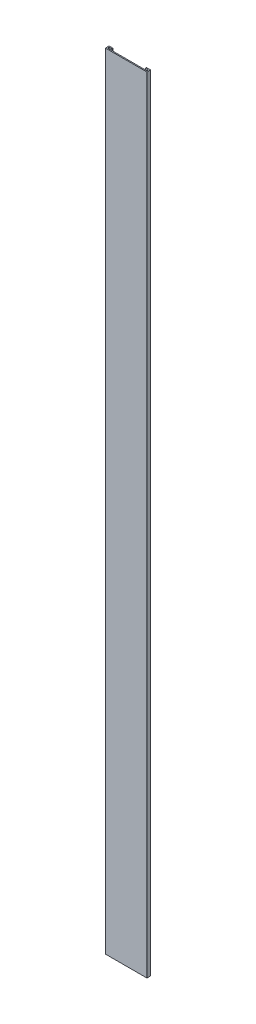
ISO-10303-21;
HEADER;
FILE_DESCRIPTION(('STEP AP214'),'2;1');
FILE_NAME('part.step','',(''),(''),'','','');
FILE_SCHEMA(('AUTOMOTIVE_DESIGN { 1 0 10303 214 1 1 1 1 }'));
ENDSEC;
DATA;
#1=APPLICATION_CONTEXT('core data for automotive mechanical design processes');
#2=APPLICATION_PROTOCOL_DEFINITION('international standard','automotive_design',2000,#1);
#3=PRODUCT_CONTEXT('',#1,'mechanical');
#4=PRODUCT('Part','Part','',(#3));
#5=PRODUCT_RELATED_PRODUCT_CATEGORY('part','',(#4));
#6=PRODUCT_DEFINITION_FORMATION('','',#4);
#7=PRODUCT_DEFINITION_CONTEXT('part definition',#1,'design');
#8=PRODUCT_DEFINITION('design','',#6,#7);
#9=PRODUCT_DEFINITION_SHAPE('','',#8);
#10=(LENGTH_UNIT() NAMED_UNIT(*) SI_UNIT(.MILLI.,.METRE.));
#11=(NAMED_UNIT(*) PLANE_ANGLE_UNIT() SI_UNIT($,.RADIAN.));
#12=(NAMED_UNIT(*) SI_UNIT($,.STERADIAN.) SOLID_ANGLE_UNIT());
#13=UNCERTAINTY_MEASURE_WITH_UNIT(LENGTH_MEASURE(1.E-05),#10,'distance_accuracy_value','');
#14=(GEOMETRIC_REPRESENTATION_CONTEXT(3) GLOBAL_UNCERTAINTY_ASSIGNED_CONTEXT((#13)) GLOBAL_UNIT_ASSIGNED_CONTEXT((#10,
#11,#12)) REPRESENTATION_CONTEXT('',''));
#15=CARTESIAN_POINT('',(0.,0.,0.));
#16=DIRECTION('',(0.,0.,1.));
#17=DIRECTION('',(1.,0.,0.));
#18=AXIS2_PLACEMENT_3D('',#15,#16,#17);
#19=CARTESIAN_POINT('',(17.6613086008675,1000.,2.65));
#20=DIRECTION('',(0.,-1.,0.));
#21=DIRECTION('',(0.,0.,-1.));
#22=AXIS2_PLACEMENT_3D('',#19,#20,#21);
#23=CYLINDRICAL_SURFACE('',#22,0.2);
#24=CARTESIAN_POINT('',(17.6613086008675,733.,2.65));
#25=DIRECTION('',(0.,-1.,0.));
#26=DIRECTION('',(0.,0.,-1.));
#27=AXIS2_PLACEMENT_3D('',#24,#25,#26);
#28=CIRCLE('',#27,0.2);
#29=CARTESIAN_POINT('',(17.6613086008675,733.,2.85000000000001));
#30=VERTEX_POINT('',#29);
#31=CARTESIAN_POINT('',(17.8613086008675,733.,2.65));
#32=VERTEX_POINT('',#31);
#33=EDGE_CURVE('E68',#30,#32,#28,.F.);
#34=ORIENTED_EDGE('',*,*,#33,.F.);
#35=DIRECTION('',(0.,-1.,0.));
#36=VECTOR('',#35,1.);
#37=CARTESIAN_POINT('',(17.6613086008675,1000.,2.85));
#38=LINE('',#37,#36);
#39=CARTESIAN_POINT('',(17.6613086008675,0.,2.85));
#40=VERTEX_POINT('',#39);
#41=EDGE_CURVE('E62',#30,#40,#38,.T.);
#42=ORIENTED_EDGE('',*,*,#41,.T.);
#43=CARTESIAN_POINT('',(17.6613086008675,0.,2.65));
#44=DIRECTION('',(0.,-1.,0.));
#45=DIRECTION('',(-1.,0.,0.));
#46=AXIS2_PLACEMENT_3D('',#43,#44,#45);
#47=CIRCLE('',#46,0.2);
#48=CARTESIAN_POINT('',(17.8613086008675,0.,2.65));
#49=VERTEX_POINT('',#48);
#50=EDGE_CURVE('E307',#49,#40,#47,.T.);
#51=ORIENTED_EDGE('',*,*,#50,.F.);
#52=DIRECTION('',(0.,-1.,0.));
#53=VECTOR('',#52,1.);
#54=CARTESIAN_POINT('',(17.8613086008675,1000.,2.65));
#55=LINE('',#54,#53);
#56=EDGE_CURVE('E75',#32,#49,#55,.T.);
#57=ORIENTED_EDGE('',*,*,#56,.F.);
#58=EDGE_LOOP('',(#34,#42,#51,#57));
#59=FACE_BOUND('',#58,.T.);
#60=ADVANCED_FACE('F54',(#59),#23,.T.);
#61=CARTESIAN_POINT('',(17.6613086008675,1000.,2.85));
#62=DIRECTION('',(0.,0.,1.));
#63=DIRECTION('',(1.,0.,0.));
#64=AXIS2_PLACEMENT_3D('',#61,#62,#63);
#65=PLANE('',#64);
#66=DIRECTION('',(1.,0.,0.));
#67=VECTOR('',#66,1.);
#68=CARTESIAN_POINT('',(-162.996189217396,733.,2.85000000000001));
#69=LINE('',#68,#67);
#70=CARTESIAN_POINT('',(-20.7365535308051,733.,2.85000000000001));
#71=VERTEX_POINT('',#70);
#72=EDGE_CURVE('E216',#71,#30,#69,.T.);
#73=ORIENTED_EDGE('',*,*,#72,.F.);
#74=DIRECTION('',(0.,-1.,0.));
#75=VECTOR('',#74,1.);
#76=CARTESIAN_POINT('',(-20.7365535308051,1000.,2.85));
#77=LINE('',#76,#75);
#78=CARTESIAN_POINT('',(-20.7365535308051,0.,2.85));
#79=VERTEX_POINT('',#78);
#80=EDGE_CURVE('E228',#71,#79,#77,.T.);
#81=ORIENTED_EDGE('',*,*,#80,.T.);
#82=DIRECTION('',(-1.,0.,0.));
#83=VECTOR('',#82,1.);
#84=CARTESIAN_POINT('',(17.6613086008675,0.,2.85));
#85=LINE('',#84,#83);
#86=EDGE_CURVE('E311',#40,#79,#85,.T.);
#87=ORIENTED_EDGE('',*,*,#86,.F.);
#88=ORIENTED_EDGE('',*,*,#41,.F.);
#89=EDGE_LOOP('',(#73,#81,#87,#88));
#90=FACE_BOUND('',#89,.T.);
#91=ADVANCED_FACE('F226',(#90),#65,.T.);
#92=CARTESIAN_POINT('',(-20.7365535308051,1000.,2.6478621316727));
#93=DIRECTION('',(0.,-1.,0.));
#94=DIRECTION('',(0.,0.,-1.));
#95=AXIS2_PLACEMENT_3D('',#92,#93,#94);
#96=CYLINDRICAL_SURFACE('',#95,0.202137868327308);
#97=CARTESIAN_POINT('',(-20.7365535308051,733.,2.6478621316727));
#98=DIRECTION('',(0.,-1.,0.));
#99=DIRECTION('',(0.,0.,-1.));
#100=AXIS2_PLACEMENT_3D('',#97,#98,#99);
#101=CIRCLE('',#100,0.202137868327308);
#102=CARTESIAN_POINT('',(-20.9386913991324,733.,2.6478621316727));
#103=VERTEX_POINT('',#102);
#104=EDGE_CURVE('E213',#103,#71,#101,.F.);
#105=ORIENTED_EDGE('',*,*,#104,.F.);
#106=DIRECTION('',(0.,-1.,0.));
#107=VECTOR('',#106,1.);
#108=CARTESIAN_POINT('',(-20.9386913991324,1000.,2.6478621316727));
#109=LINE('',#108,#107);
#110=CARTESIAN_POINT('',(-20.9386913991324,0.,2.6478621316727));
#111=VERTEX_POINT('',#110);
#112=EDGE_CURVE('E238',#103,#111,#109,.T.);
#113=ORIENTED_EDGE('',*,*,#112,.T.);
#114=CARTESIAN_POINT('',(-20.7365535308051,0.,2.6478621316727));
#115=DIRECTION('',(0.,-1.,0.));
#116=DIRECTION('',(1.,0.,0.));
#117=AXIS2_PLACEMENT_3D('',#114,#115,#116);
#118=CIRCLE('',#117,0.202137868327308);
#119=EDGE_CURVE('E235',#79,#111,#118,.T.);
#120=ORIENTED_EDGE('',*,*,#119,.F.);
#121=ORIENTED_EDGE('',*,*,#80,.F.);
#122=EDGE_LOOP('',(#105,#113,#120,#121));
#123=FACE_BOUND('',#122,.T.);
#124=ADVANCED_FACE('F233',(#123),#96,.T.);
#125=CARTESIAN_POINT('',(-20.9386913991324,1000.,2.6478621316727));
#126=DIRECTION('',(-1.,0.,0.));
#127=DIRECTION('',(0.,0.,1.));
#128=AXIS2_PLACEMENT_3D('',#125,#126,#127);
#129=PLANE('',#128);
#130=DIRECTION('',(0.,0.,1.));
#131=VECTOR('',#130,1.);
#132=CARTESIAN_POINT('',(-20.9386913991324,733.,2.6478621316727));
#133=LINE('',#132,#131);
#134=CARTESIAN_POINT('',(-20.9386913991324,733.,-0.350017840413514));
#135=VERTEX_POINT('',#134);
#136=EDGE_CURVE('E218',#135,#103,#133,.T.);
#137=ORIENTED_EDGE('',*,*,#136,.F.);
#138=DIRECTION('',(0.,-1.,0.));
#139=VECTOR('',#138,1.);
#140=CARTESIAN_POINT('',(-20.9386913991324,1000.,-0.350017840413514));
#141=LINE('',#140,#139);
#142=CARTESIAN_POINT('',(-20.9386913991324,0.,-0.350017840413514));
#143=VERTEX_POINT('',#142);
#144=EDGE_CURVE('E242',#135,#143,#141,.T.);
#145=ORIENTED_EDGE('',*,*,#144,.T.);
#146=DIRECTION('',(0.,0.,-1.));
#147=VECTOR('',#146,1.);
#148=CARTESIAN_POINT('',(-20.9386913991324,0.,2.6478621316727));
#149=LINE('',#148,#147);
#150=EDGE_CURVE('E390',#111,#143,#149,.T.);
#151=ORIENTED_EDGE('',*,*,#150,.F.);
#152=ORIENTED_EDGE('',*,*,#112,.F.);
#153=EDGE_LOOP('',(#137,#145,#151,#152));
#154=FACE_BOUND('',#153,.T.);
#155=ADVANCED_FACE('F556',(#154),#129,.T.);
#156=CARTESIAN_POINT('',(-20.7386913991324,1000.,-0.350017840413514));
#157=DIRECTION('',(0.,-1.,0.));
#158=DIRECTION('',(0.,0.,-1.));
#159=AXIS2_PLACEMENT_3D('',#156,#157,#158);
#160=CYLINDRICAL_SURFACE('',#159,0.2);
#161=CARTESIAN_POINT('',(-20.7386913991324,733.,-0.350017840413514));
#162=DIRECTION('',(0.,-1.,0.));
#163=DIRECTION('',(0.,0.,-1.));
#164=AXIS2_PLACEMENT_3D('',#161,#162,#163);
#165=CIRCLE('',#164,0.2);
#166=CARTESIAN_POINT('',(-20.7387092403416,733.,-0.550017839617743));
#167=VERTEX_POINT('',#166);
#168=EDGE_CURVE('E402',#167,#135,#165,.F.);
#169=ORIENTED_EDGE('',*,*,#168,.F.);
#170=DIRECTION('',(0.,-1.,0.));
#171=VECTOR('',#170,1.);
#172=CARTESIAN_POINT('',(-20.7387092403416,1000.,-0.550017839617742));
#173=LINE('',#172,#171);
#174=CARTESIAN_POINT('',(-20.7387092403416,0.,-0.550017839617742));
#175=VERTEX_POINT('',#174);
#176=EDGE_CURVE('E247',#167,#175,#173,.T.);
#177=ORIENTED_EDGE('',*,*,#176,.T.);
#178=CARTESIAN_POINT('',(-20.7386913991324,0.,-0.350017840413514));
#179=DIRECTION('',(0.,-1.,0.));
#180=DIRECTION('',(1.,0.,0.));
#181=AXIS2_PLACEMENT_3D('',#178,#179,#180);
#182=CIRCLE('',#181,0.2);
#183=EDGE_CURVE('E386',#143,#175,#182,.T.);
#184=ORIENTED_EDGE('',*,*,#183,.F.);
#185=ORIENTED_EDGE('',*,*,#144,.F.);
#186=EDGE_LOOP('',(#169,#177,#184,#185));
#187=FACE_BOUND('',#186,.T.);
#188=ADVANCED_FACE('F553',(#187),#160,.T.);
#189=CARTESIAN_POINT('',(-20.7387092403416,1000.,-0.550017839617743));
#190=DIRECTION('',(-8.92060461032424E-05,0.,-0.999999996021141));
#191=DIRECTION('',(-0.999999996021141,0.,8.92060461032424E-05));
#192=AXIS2_PLACEMENT_3D('',#189,#190,#191);
#193=PLANE('',#192);
#194=DIRECTION('',(-0.999999996021141,0.,8.92060461032424E-05));
#195=VECTOR('',#194,1.);
#196=CARTESIAN_POINT('',(-20.7387092403416,733.,-0.550017839617743));
#197=LINE('',#196,#195);
#198=CARTESIAN_POINT('',(-17.172421380223,733.,-0.550335973844492));
#199=VERTEX_POINT('',#198);
#200=EDGE_CURVE('E405',#199,#167,#197,.T.);
#201=ORIENTED_EDGE('',*,*,#200,.F.);
#202=DIRECTION('',(0.,-1.,0.));
#203=VECTOR('',#202,1.);
#204=CARTESIAN_POINT('',(-17.1724261732622,1000.,-0.550335973630708));
#205=LINE('',#204,#203);
#206=CARTESIAN_POINT('',(-17.1724261732622,0.,-0.550335973630708));
#207=VERTEX_POINT('',#206);
#208=EDGE_CURVE('E250',#199,#207,#205,.T.);
#209=ORIENTED_EDGE('',*,*,#208,.T.);
#210=DIRECTION('',(0.999999996021141,0.,-8.92060461032424E-05));
#211=VECTOR('',#210,1.);
#212=CARTESIAN_POINT('',(-20.7387092403416,0.,-0.550017839617743));
#213=LINE('',#212,#211);
#214=EDGE_CURVE('E382',#175,#207,#213,.T.);
#215=ORIENTED_EDGE('',*,*,#214,.F.);
#216=ORIENTED_EDGE('',*,*,#176,.F.);
#217=EDGE_LOOP('',(#201,#209,#215,#216));
#218=FACE_BOUND('',#217,.T.);
#219=ADVANCED_FACE('F549',(#218),#193,.T.);
#220=CARTESIAN_POINT('',(-17.172421380223,1000.,-0.496605992753914));
#221=DIRECTION('',(0.,-1.,0.));
#222=DIRECTION('',(0.,0.,-1.));
#223=AXIS2_PLACEMENT_3D('',#220,#221,#222);
#224=CYLINDRICAL_SURFACE('',#223,0.0537299810905782);
#225=CARTESIAN_POINT('',(-17.172421380223,733.,-0.496605992753914));
#226=DIRECTION('',(0.,-1.,0.));
#227=DIRECTION('',(0.,0.,-1.));
#228=AXIS2_PLACEMENT_3D('',#225,#226,#227);
#229=CIRCLE('',#228,0.0537299810905782);
#230=CARTESIAN_POINT('',(-17.1186913991324,733.,-0.496605992753914));
#231=VERTEX_POINT('',#230);
#232=EDGE_CURVE('E408',#231,#199,#229,.F.);
#233=ORIENTED_EDGE('',*,*,#232,.F.);
#234=DIRECTION('',(0.,-1.,0.));
#235=VECTOR('',#234,1.);
#236=CARTESIAN_POINT('',(-17.1186913991324,1000.,-0.496605992753914));
#237=LINE('',#236,#235);
#238=CARTESIAN_POINT('',(-17.1186913991324,0.,-0.496605992753914));
#239=VERTEX_POINT('',#238);
#240=EDGE_CURVE('E253',#231,#239,#237,.T.);
#241=ORIENTED_EDGE('',*,*,#240,.T.);
#242=CARTESIAN_POINT('',(-17.172421380223,0.,-0.496605992753914));
#243=DIRECTION('',(0.,-1.,0.));
#244=DIRECTION('',(-1.,0.,0.));
#245=AXIS2_PLACEMENT_3D('',#242,#243,#244);
#246=CIRCLE('',#245,0.0537299810905782);
#247=EDGE_CURVE('E378',#207,#239,#246,.T.);
#248=ORIENTED_EDGE('',*,*,#247,.F.);
#249=ORIENTED_EDGE('',*,*,#208,.F.);
#250=EDGE_LOOP('',(#233,#241,#248,#249));
#251=FACE_BOUND('',#250,.T.);
#252=ADVANCED_FACE('F543',(#251),#224,.T.);
#253=CARTESIAN_POINT('',(-17.1186913991324,1000.,0.395460094911339));
#254=DIRECTION('',(1.,0.,0.));
#255=DIRECTION('',(0.,0.,-1.));
#256=AXIS2_PLACEMENT_3D('',#253,#254,#255);
#257=PLANE('',#256);
#258=DIRECTION('',(0.,0.,-1.));
#259=VECTOR('',#258,1.);
#260=CARTESIAN_POINT('',(-17.1186913991324,733.,0.395460094911339));
#261=LINE('',#260,#259);
#262=CARTESIAN_POINT('',(-17.1186913991324,733.,0.395460094911339));
#263=VERTEX_POINT('',#262);
#264=EDGE_CURVE('E411',#263,#231,#261,.T.);
#265=ORIENTED_EDGE('',*,*,#264,.F.);
#266=DIRECTION('',(0.,-1.,0.));
#267=VECTOR('',#266,1.);
#268=CARTESIAN_POINT('',(-17.1186913991324,1000.,0.395460094911339));
#269=LINE('',#268,#267);
#270=CARTESIAN_POINT('',(-17.1186913991324,0.,0.395460094911339));
#271=VERTEX_POINT('',#270);
#272=EDGE_CURVE('E256',#263,#271,#269,.T.);
#273=ORIENTED_EDGE('',*,*,#272,.T.);
#274=DIRECTION('',(0.,0.,1.));
#275=VECTOR('',#274,1.);
#276=CARTESIAN_POINT('',(-17.1186913991324,0.,0.395460094911339));
#277=LINE('',#276,#275);
#278=EDGE_CURVE('E374',#239,#271,#277,.T.);
#279=ORIENTED_EDGE('',*,*,#278,.F.);
#280=ORIENTED_EDGE('',*,*,#240,.F.);
#281=EDGE_LOOP('',(#265,#273,#279,#280));
#282=FACE_BOUND('',#281,.T.);
#283=ADVANCED_FACE('F539',(#282),#257,.T.);
#284=CARTESIAN_POINT('',(-17.1728953762093,1000.,0.395460094911339));
#285=DIRECTION('',(0.,-1.,0.));
#286=DIRECTION('',(0.,0.,-1.));
#287=AXIS2_PLACEMENT_3D('',#284,#285,#286);
#288=CYLINDRICAL_SURFACE('',#287,0.054203977076882);
#289=CARTESIAN_POINT('',(-17.1728953762093,733.,0.395460094911339));
#290=DIRECTION('',(0.,-1.,0.));
#291=DIRECTION('',(0.,0.,-1.));
#292=AXIS2_PLACEMENT_3D('',#289,#290,#291);
#293=CIRCLE('',#292,0.054203977076882);
#294=CARTESIAN_POINT('',(-17.1728905408868,733.,0.449664071772553));
#295=VERTEX_POINT('',#294);
#296=EDGE_CURVE('E414',#295,#263,#293,.F.);
#297=ORIENTED_EDGE('',*,*,#296,.F.);
#298=DIRECTION('',(0.,-1.,0.));
#299=VECTOR('',#298,1.);
#300=CARTESIAN_POINT('',(-17.1728905408869,1000.,0.449664071772552));
#301=LINE('',#300,#299);
#302=CARTESIAN_POINT('',(-17.1728905408869,0.,0.449664071772552));
#303=VERTEX_POINT('',#302);
#304=EDGE_CURVE('E259',#295,#303,#301,.T.);
#305=ORIENTED_EDGE('',*,*,#304,.T.);
#306=CARTESIAN_POINT('',(-17.1728953762093,0.,0.395460094911339));
#307=DIRECTION('',(0.,-1.,0.));
#308=DIRECTION('',(-1.,0.,0.));
#309=AXIS2_PLACEMENT_3D('',#306,#307,#308);
#310=CIRCLE('',#309,0.054203977076882);
#311=EDGE_CURVE('E370',#271,#303,#310,.T.);
#312=ORIENTED_EDGE('',*,*,#311,.F.);
#313=ORIENTED_EDGE('',*,*,#272,.F.);
#314=EDGE_LOOP('',(#297,#305,#312,#313));
#315=FACE_BOUND('',#314,.T.);
#316=ADVANCED_FACE('F533',(#315),#288,.T.);
#317=CARTESIAN_POINT('',(-19.7387092403416,1000.,0.449892958314661));
#318=DIRECTION('',(8.92060461036404E-05,0.,0.999999996021141));
#319=DIRECTION('',(0.999999996021141,0.,-8.92060461036404E-05));
#320=AXIS2_PLACEMENT_3D('',#317,#318,#319);
#321=PLANE('',#320);
#322=DIRECTION('',(0.999999996021141,0.,-8.92060461036404E-05));
#323=VECTOR('',#322,1.);
#324=CARTESIAN_POINT('',(-19.7387092403416,733.,0.449892958314661));
#325=LINE('',#324,#323);
#326=CARTESIAN_POINT('',(-19.7387092403416,733.,0.44989295831466));
#327=VERTEX_POINT('',#326);
#328=EDGE_CURVE('E417',#327,#295,#325,.T.);
#329=ORIENTED_EDGE('',*,*,#328,.F.);
#330=DIRECTION('',(0.,-1.,0.));
#331=VECTOR('',#330,1.);
#332=CARTESIAN_POINT('',(-19.7387092403416,1000.,0.449892958314661));
#333=LINE('',#332,#331);
#334=CARTESIAN_POINT('',(-19.7387092403416,0.,0.449892958314661));
#335=VERTEX_POINT('',#334);
#336=EDGE_CURVE('E262',#327,#335,#333,.T.);
#337=ORIENTED_EDGE('',*,*,#336,.T.);
#338=DIRECTION('',(-0.999999996021141,0.,8.92060461036404E-05));
#339=VECTOR('',#338,1.);
#340=CARTESIAN_POINT('',(-19.7387092403416,0.,0.449892958314661));
#341=LINE('',#340,#339);
#342=EDGE_CURVE('E366',#303,#335,#341,.T.);
#343=ORIENTED_EDGE('',*,*,#342,.F.);
#344=ORIENTED_EDGE('',*,*,#304,.F.);
#345=EDGE_LOOP('',(#329,#337,#343,#344));
#346=FACE_BOUND('',#345,.T.);
#347=ADVANCED_FACE('F529',(#346),#321,.T.);
#348=CARTESIAN_POINT('',(-19.7386913991324,1000.,0.649892957518888));
#349=DIRECTION('',(0.,-1.,0.));
#350=DIRECTION('',(0.,0.,-1.));
#351=AXIS2_PLACEMENT_3D('',#348,#349,#350);
#352=CYLINDRICAL_SURFACE('',#351,0.2);
#353=CARTESIAN_POINT('',(-19.7386913991324,733.,0.649892957518888));
#354=DIRECTION('',(0.,-1.,0.));
#355=DIRECTION('',(0.,0.,-1.));
#356=AXIS2_PLACEMENT_3D('',#353,#354,#355);
#357=CIRCLE('',#356,0.2);
#358=CARTESIAN_POINT('',(-19.9386913991324,733.,0.649892957518889));
#359=VERTEX_POINT('',#358);
#360=EDGE_CURVE('E420',#359,#327,#357,.T.);
#361=ORIENTED_EDGE('',*,*,#360,.F.);
#362=DIRECTION('',(0.,-1.,0.));
#363=VECTOR('',#362,1.);
#364=CARTESIAN_POINT('',(-19.9386913991324,1000.,0.649892957518889));
#365=LINE('',#364,#363);
#366=CARTESIAN_POINT('',(-19.9386913991324,0.,0.649892957518889));
#367=VERTEX_POINT('',#366);
#368=EDGE_CURVE('E265',#359,#367,#365,.T.);
#369=ORIENTED_EDGE('',*,*,#368,.T.);
#370=CARTESIAN_POINT('',(-19.7386913991324,0.,0.649892957518888));
#371=DIRECTION('',(0.,1.,0.));
#372=DIRECTION('',(1.,0.,0.));
#373=AXIS2_PLACEMENT_3D('',#370,#371,#372);
#374=CIRCLE('',#373,0.2);
#375=EDGE_CURVE('E362',#335,#367,#374,.T.);
#376=ORIENTED_EDGE('',*,*,#375,.F.);
#377=ORIENTED_EDGE('',*,*,#336,.F.);
#378=EDGE_LOOP('',(#361,#369,#376,#377));
#379=FACE_BOUND('',#378,.T.);
#380=ADVANCED_FACE('F523',(#379),#352,.F.);
#381=CARTESIAN_POINT('',(-19.9386913991324,1000.,1.75978827643367));
#382=DIRECTION('',(1.,0.,0.));
#383=DIRECTION('',(0.,0.,-1.));
#384=AXIS2_PLACEMENT_3D('',#381,#382,#383);
#385=PLANE('',#384);
#386=DIRECTION('',(0.,0.,-1.));
#387=VECTOR('',#386,1.);
#388=CARTESIAN_POINT('',(-19.9386913991324,733.,1.75978827643367));
#389=LINE('',#388,#387);
#390=CARTESIAN_POINT('',(-19.9386913991324,733.,1.75978827643367));
#391=VERTEX_POINT('',#390);
#392=EDGE_CURVE('E423',#391,#359,#389,.T.);
#393=ORIENTED_EDGE('',*,*,#392,.F.);
#394=DIRECTION('',(0.,-1.,0.));
#395=VECTOR('',#394,1.);
#396=CARTESIAN_POINT('',(-19.9386913991324,1000.,1.75978827643367));
#397=LINE('',#396,#395);
#398=CARTESIAN_POINT('',(-19.9386913991324,0.,1.75978827643367));
#399=VERTEX_POINT('',#398);
#400=EDGE_CURVE('E268',#391,#399,#397,.T.);
#401=ORIENTED_EDGE('',*,*,#400,.T.);
#402=DIRECTION('',(0.,0.,1.));
#403=VECTOR('',#402,1.);
#404=CARTESIAN_POINT('',(-19.9386913991324,0.,1.75978827643367));
#405=LINE('',#404,#403);
#406=EDGE_CURVE('E358',#367,#399,#405,.T.);
#407=ORIENTED_EDGE('',*,*,#406,.F.);
#408=ORIENTED_EDGE('',*,*,#368,.F.);
#409=EDGE_LOOP('',(#393,#401,#407,#408));
#410=FACE_BOUND('',#409,.T.);
#411=ADVANCED_FACE('F519',(#410),#385,.T.);
#412=CARTESIAN_POINT('',(-19.8484796755661,1000.,1.75978827643367));
#413=DIRECTION('',(0.,-1.,0.));
#414=DIRECTION('',(0.,0.,-1.));
#415=AXIS2_PLACEMENT_3D('',#412,#413,#414);
#416=CYLINDRICAL_SURFACE('',#415,0.0902117235663378);
#417=CARTESIAN_POINT('',(-19.8484796755661,733.,1.75978827643367));
#418=DIRECTION('',(0.,-1.,0.));
#419=DIRECTION('',(0.,0.,-1.));
#420=AXIS2_PLACEMENT_3D('',#417,#418,#419);
#421=CIRCLE('',#420,0.0902117235663378);
#422=CARTESIAN_POINT('',(-19.8484796755661,733.,1.85000000000001));
#423=VERTEX_POINT('',#422);
#424=EDGE_CURVE('E426',#423,#391,#421,.T.);
#425=ORIENTED_EDGE('',*,*,#424,.F.);
#426=DIRECTION('',(0.,-1.,0.));
#427=VECTOR('',#426,1.);
#428=CARTESIAN_POINT('',(-19.8484796755661,1000.,1.85));
#429=LINE('',#428,#427);
#430=CARTESIAN_POINT('',(-19.8484796755661,0.,1.85));
#431=VERTEX_POINT('',#430);
#432=EDGE_CURVE('E271',#423,#431,#429,.T.);
#433=ORIENTED_EDGE('',*,*,#432,.T.);
#434=CARTESIAN_POINT('',(-19.8484796755661,0.,1.75978827643367));
#435=DIRECTION('',(0.,1.,0.));
#436=DIRECTION('',(1.,0.,0.));
#437=AXIS2_PLACEMENT_3D('',#434,#435,#436);
#438=CIRCLE('',#437,0.0902117235663378);
#439=EDGE_CURVE('E354',#399,#431,#438,.T.);
#440=ORIENTED_EDGE('',*,*,#439,.F.);
#441=ORIENTED_EDGE('',*,*,#400,.F.);
#442=EDGE_LOOP('',(#425,#433,#440,#441));
#443=FACE_BOUND('',#442,.T.);
#444=ADVANCED_FACE('F513',(#443),#416,.F.);
#445=CARTESIAN_POINT('',(16.6613086008675,1000.,1.85));
#446=DIRECTION('',(0.,0.,-1.));
#447=DIRECTION('',(-1.,0.,0.));
#448=AXIS2_PLACEMENT_3D('',#445,#446,#447);
#449=PLANE('',#448);
#450=DIRECTION('',(-1.,0.,0.));
#451=VECTOR('',#450,1.);
#452=CARTESIAN_POINT('',(16.6613086008675,733.,1.85));
#453=LINE('',#452,#451);
#454=CARTESIAN_POINT('',(16.6613086008675,733.,1.85));
#455=VERTEX_POINT('',#454);
#456=EDGE_CURVE('E429',#455,#423,#453,.T.);
#457=ORIENTED_EDGE('',*,*,#456,.F.);
#458=DIRECTION('',(0.,-1.,0.));
#459=VECTOR('',#458,1.);
#460=CARTESIAN_POINT('',(16.6613086008675,1000.,1.85));
#461=LINE('',#460,#459);
#462=CARTESIAN_POINT('',(16.6613086008675,0.,1.85));
#463=VERTEX_POINT('',#462);
#464=EDGE_CURVE('E274',#455,#463,#461,.T.);
#465=ORIENTED_EDGE('',*,*,#464,.T.);
#466=DIRECTION('',(1.,0.,0.));
#467=VECTOR('',#466,1.);
#468=CARTESIAN_POINT('',(16.6613086008675,0.,1.85));
#469=LINE('',#468,#467);
#470=EDGE_CURVE('E350',#431,#463,#469,.T.);
#471=ORIENTED_EDGE('',*,*,#470,.F.);
#472=ORIENTED_EDGE('',*,*,#432,.F.);
#473=EDGE_LOOP('',(#457,#465,#471,#472));
#474=FACE_BOUND('',#473,.T.);
#475=ADVANCED_FACE('F509',(#474),#449,.T.);
#476=CARTESIAN_POINT('',(16.6613086008675,1000.,1.65));
#477=DIRECTION('',(0.,-1.,0.));
#478=DIRECTION('',(0.,0.,-1.));
#479=AXIS2_PLACEMENT_3D('',#476,#477,#478);
#480=CYLINDRICAL_SURFACE('',#479,0.2);
#481=CARTESIAN_POINT('',(16.6613086008675,733.,1.65));
#482=DIRECTION('',(0.,-1.,0.));
#483=DIRECTION('',(0.,0.,-1.));
#484=AXIS2_PLACEMENT_3D('',#481,#482,#483);
#485=CIRCLE('',#484,0.2);
#486=CARTESIAN_POINT('',(16.8613086008675,733.,1.65));
#487=VERTEX_POINT('',#486);
#488=EDGE_CURVE('E432',#487,#455,#485,.T.);
#489=ORIENTED_EDGE('',*,*,#488,.F.);
#490=DIRECTION('',(0.,-1.,0.));
#491=VECTOR('',#490,1.);
#492=CARTESIAN_POINT('',(16.8613086008675,1000.,1.65));
#493=LINE('',#492,#491);
#494=CARTESIAN_POINT('',(16.8613086008675,0.,1.65));
#495=VERTEX_POINT('',#494);
#496=EDGE_CURVE('E277',#487,#495,#493,.T.);
#497=ORIENTED_EDGE('',*,*,#496,.T.);
#498=CARTESIAN_POINT('',(16.6613086008675,0.,1.65));
#499=DIRECTION('',(0.,1.,0.));
#500=DIRECTION('',(-1.,0.,0.));
#501=AXIS2_PLACEMENT_3D('',#498,#499,#500);
#502=CIRCLE('',#501,0.2);
#503=EDGE_CURVE('E346',#463,#495,#502,.T.);
#504=ORIENTED_EDGE('',*,*,#503,.F.);
#505=ORIENTED_EDGE('',*,*,#464,.F.);
#506=EDGE_LOOP('',(#489,#497,#504,#505));
#507=FACE_BOUND('',#506,.T.);
#508=ADVANCED_FACE('F503',(#507),#480,.F.);
#509=CARTESIAN_POINT('',(16.8613086008675,1000.,0.65));
#510=DIRECTION('',(-1.,0.,0.));
#511=DIRECTION('',(0.,0.,1.));
#512=AXIS2_PLACEMENT_3D('',#509,#510,#511);
#513=PLANE('',#512);
#514=DIRECTION('',(0.,0.,1.));
#515=VECTOR('',#514,1.);
#516=CARTESIAN_POINT('',(16.8613086008675,733.,0.65));
#517=LINE('',#516,#515);
#518=CARTESIAN_POINT('',(16.8613086008675,733.,0.65));
#519=VERTEX_POINT('',#518);
#520=EDGE_CURVE('E435',#519,#487,#517,.T.);
#521=ORIENTED_EDGE('',*,*,#520,.F.);
#522=DIRECTION('',(0.,-1.,0.));
#523=VECTOR('',#522,1.);
#524=CARTESIAN_POINT('',(16.8613086008675,1000.,0.65));
#525=LINE('',#524,#523);
#526=CARTESIAN_POINT('',(16.8613086008675,0.,0.65));
#527=VERTEX_POINT('',#526);
#528=EDGE_CURVE('E280',#519,#527,#525,.T.);
#529=ORIENTED_EDGE('',*,*,#528,.T.);
#530=DIRECTION('',(0.,0.,-1.));
#531=VECTOR('',#530,1.);
#532=CARTESIAN_POINT('',(16.8613086008675,0.,0.65));
#533=LINE('',#532,#531);
#534=EDGE_CURVE('E342',#495,#527,#533,.T.);
#535=ORIENTED_EDGE('',*,*,#534,.F.);
#536=ORIENTED_EDGE('',*,*,#496,.F.);
#537=EDGE_LOOP('',(#521,#529,#535,#536));
#538=FACE_BOUND('',#537,.T.);
#539=ADVANCED_FACE('F499',(#538),#513,.T.);
#540=CARTESIAN_POINT('',(16.6613086008675,1000.,0.65));
#541=DIRECTION('',(0.,-1.,0.));
#542=DIRECTION('',(0.,0.,-1.));
#543=AXIS2_PLACEMENT_3D('',#540,#541,#542);
#544=CYLINDRICAL_SURFACE('',#543,0.2);
#545=CARTESIAN_POINT('',(16.6613086008675,733.,0.65));
#546=DIRECTION('',(0.,-1.,0.));
#547=DIRECTION('',(0.,0.,-1.));
#548=AXIS2_PLACEMENT_3D('',#545,#546,#547);
#549=CIRCLE('',#548,0.2);
#550=CARTESIAN_POINT('',(16.6613086008675,733.,0.45));
#551=VERTEX_POINT('',#550);
#552=EDGE_CURVE('E438',#551,#519,#549,.T.);
#553=ORIENTED_EDGE('',*,*,#552,.F.);
#554=DIRECTION('',(0.,-1.,0.));
#555=VECTOR('',#554,1.);
#556=CARTESIAN_POINT('',(16.6613086008675,1000.,0.45));
#557=LINE('',#556,#555);
#558=CARTESIAN_POINT('',(16.6613086008675,0.,0.45));
#559=VERTEX_POINT('',#558);
#560=EDGE_CURVE('E283',#551,#559,#557,.T.);
#561=ORIENTED_EDGE('',*,*,#560,.T.);
#562=CARTESIAN_POINT('',(16.6613086008675,0.,0.65));
#563=DIRECTION('',(0.,1.,0.));
#564=DIRECTION('',(-1.,0.,0.));
#565=AXIS2_PLACEMENT_3D('',#562,#563,#564);
#566=CIRCLE('',#565,0.2);
#567=EDGE_CURVE('E338',#527,#559,#566,.T.);
#568=ORIENTED_EDGE('',*,*,#567,.F.);
#569=ORIENTED_EDGE('',*,*,#528,.F.);
#570=EDGE_LOOP('',(#553,#561,#568,#569));
#571=FACE_BOUND('',#570,.T.);
#572=ADVANCED_FACE('F493',(#571),#544,.F.);
#573=CARTESIAN_POINT('',(14.0887481119377,1000.,0.45));
#574=DIRECTION('',(0.,0.,1.));
#575=DIRECTION('',(1.,0.,0.));
#576=AXIS2_PLACEMENT_3D('',#573,#574,#575);
#577=PLANE('',#576);
#578=DIRECTION('',(1.,0.,0.));
#579=VECTOR('',#578,1.);
#580=CARTESIAN_POINT('',(14.0887481119377,733.,0.45));
#581=LINE('',#580,#579);
#582=CARTESIAN_POINT('',(14.0887481119377,733.,0.45));
#583=VERTEX_POINT('',#582);
#584=EDGE_CURVE('E441',#583,#551,#581,.T.);
#585=ORIENTED_EDGE('',*,*,#584,.F.);
#586=DIRECTION('',(0.,-1.,0.));
#587=VECTOR('',#586,1.);
#588=CARTESIAN_POINT('',(14.0887481119377,1000.,0.45));
#589=LINE('',#588,#587);
#590=CARTESIAN_POINT('',(14.0887481119377,0.,0.45));
#591=VERTEX_POINT('',#590);
#592=EDGE_CURVE('E286',#583,#591,#589,.T.);
#593=ORIENTED_EDGE('',*,*,#592,.T.);
#594=DIRECTION('',(-1.,0.,0.));
#595=VECTOR('',#594,1.);
#596=CARTESIAN_POINT('',(14.0887481119377,0.,0.45));
#597=LINE('',#596,#595);
#598=EDGE_CURVE('E334',#559,#591,#597,.T.);
#599=ORIENTED_EDGE('',*,*,#598,.F.);
#600=ORIENTED_EDGE('',*,*,#560,.F.);
#601=EDGE_LOOP('',(#585,#593,#599,#600));
#602=FACE_BOUND('',#601,.T.);
#603=ADVANCED_FACE('F489',(#602),#577,.T.);
#604=CARTESIAN_POINT('',(14.0887481119377,1000.,0.4));
#605=DIRECTION('',(0.,-1.,0.));
#606=DIRECTION('',(0.,0.,-1.));
#607=AXIS2_PLACEMENT_3D('',#604,#605,#606);
#608=CYLINDRICAL_SURFACE('',#607,0.05);
#609=CARTESIAN_POINT('',(14.0887481119377,733.,0.4));
#610=DIRECTION('',(0.,-1.,0.));
#611=DIRECTION('',(0.,0.,-1.));
#612=AXIS2_PLACEMENT_3D('',#609,#610,#611);
#613=CIRCLE('',#612,0.05);
#614=CARTESIAN_POINT('',(14.0387481119377,733.,0.4));
#615=VERTEX_POINT('',#614);
#616=EDGE_CURVE('E444',#615,#583,#613,.F.);
#617=ORIENTED_EDGE('',*,*,#616,.F.);
#618=DIRECTION('',(0.,-1.,0.));
#619=VECTOR('',#618,1.);
#620=CARTESIAN_POINT('',(14.0387481119377,1000.,0.4));
#621=LINE('',#620,#619);
#622=CARTESIAN_POINT('',(14.0387481119377,0.,0.4));
#623=VERTEX_POINT('',#622);
#624=EDGE_CURVE('E289',#615,#623,#621,.T.);
#625=ORIENTED_EDGE('',*,*,#624,.T.);
#626=CARTESIAN_POINT('',(14.0887481119377,0.,0.4));
#627=DIRECTION('',(0.,-1.,0.));
#628=DIRECTION('',(1.,0.,0.));
#629=AXIS2_PLACEMENT_3D('',#626,#627,#628);
#630=CIRCLE('',#629,0.05);
#631=EDGE_CURVE('E330',#591,#623,#630,.T.);
#632=ORIENTED_EDGE('',*,*,#631,.F.);
#633=ORIENTED_EDGE('',*,*,#592,.F.);
#634=EDGE_LOOP('',(#617,#625,#632,#633));
#635=FACE_BOUND('',#634,.T.);
#636=ADVANCED_FACE('F483',(#635),#608,.T.);
#637=CARTESIAN_POINT('',(14.0387481119377,1000.,0.4));
#638=DIRECTION('',(-1.,0.,0.));
#639=DIRECTION('',(0.,0.,1.));
#640=AXIS2_PLACEMENT_3D('',#637,#638,#639);
#641=PLANE('',#640);
#642=DIRECTION('',(0.,0.,1.));
#643=VECTOR('',#642,1.);
#644=CARTESIAN_POINT('',(14.0387481119377,733.,0.4));
#645=LINE('',#644,#643);
#646=CARTESIAN_POINT('',(14.0387481119377,733.,-0.5));
#647=VERTEX_POINT('',#646);
#648=EDGE_CURVE('E447',#647,#615,#645,.T.);
#649=ORIENTED_EDGE('',*,*,#648,.F.);
#650=DIRECTION('',(0.,-1.,0.));
#651=VECTOR('',#650,1.);
#652=CARTESIAN_POINT('',(14.0387481119377,1000.,-0.5));
#653=LINE('',#652,#651);
#654=CARTESIAN_POINT('',(14.0387481119377,0.,-0.5));
#655=VERTEX_POINT('',#654);
#656=EDGE_CURVE('E292',#647,#655,#653,.T.);
#657=ORIENTED_EDGE('',*,*,#656,.T.);
#658=DIRECTION('',(0.,0.,-1.));
#659=VECTOR('',#658,1.);
#660=CARTESIAN_POINT('',(14.0387481119377,0.,0.4));
#661=LINE('',#660,#659);
#662=EDGE_CURVE('E326',#623,#655,#661,.T.);
#663=ORIENTED_EDGE('',*,*,#662,.F.);
#664=ORIENTED_EDGE('',*,*,#624,.F.);
#665=EDGE_LOOP('',(#649,#657,#663,#664));
#666=FACE_BOUND('',#665,.T.);
#667=ADVANCED_FACE('F480',(#666),#641,.T.);
#668=CARTESIAN_POINT('',(14.0887481119377,1000.,-0.5));
#669=DIRECTION('',(0.,-1.,0.));
#670=DIRECTION('',(0.,0.,-1.));
#671=AXIS2_PLACEMENT_3D('',#668,#669,#670);
#672=CYLINDRICAL_SURFACE('',#671,0.05);
#673=CARTESIAN_POINT('',(14.0887481119377,733.,-0.5));
#674=DIRECTION('',(0.,-1.,0.));
#675=DIRECTION('',(0.,0.,-1.));
#676=AXIS2_PLACEMENT_3D('',#673,#674,#675);
#677=CIRCLE('',#676,0.05);
#678=CARTESIAN_POINT('',(14.0887481119377,733.,-0.55));
#679=VERTEX_POINT('',#678);
#680=EDGE_CURVE('E450',#679,#647,#677,.F.);
#681=ORIENTED_EDGE('',*,*,#680,.F.);
#682=DIRECTION('',(0.,-1.,0.));
#683=VECTOR('',#682,1.);
#684=CARTESIAN_POINT('',(14.0887481119377,1000.,-0.55));
#685=LINE('',#684,#683);
#686=CARTESIAN_POINT('',(14.0887481119377,0.,-0.55));
#687=VERTEX_POINT('',#686);
#688=EDGE_CURVE('E295',#679,#687,#685,.T.);
#689=ORIENTED_EDGE('',*,*,#688,.T.);
#690=CARTESIAN_POINT('',(14.0887481119377,0.,-0.5));
#691=DIRECTION('',(0.,-1.,0.));
#692=DIRECTION('',(1.,0.,0.));
#693=AXIS2_PLACEMENT_3D('',#690,#691,#692);
#694=CIRCLE('',#693,0.05);
#695=EDGE_CURVE('E322',#655,#687,#694,.T.);
#696=ORIENTED_EDGE('',*,*,#695,.F.);
#697=ORIENTED_EDGE('',*,*,#656,.F.);
#698=EDGE_LOOP('',(#681,#689,#696,#697));
#699=FACE_BOUND('',#698,.T.);
#700=ADVANCED_FACE('F475',(#699),#672,.T.);
#701=CARTESIAN_POINT('',(14.0887481119377,1000.,-0.55));
#702=DIRECTION('',(0.,0.,-1.));
#703=DIRECTION('',(-1.,0.,0.));
#704=AXIS2_PLACEMENT_3D('',#701,#702,#703);
#705=PLANE('',#704);
#706=DIRECTION('',(-1.,0.,0.));
#707=VECTOR('',#706,1.);
#708=CARTESIAN_POINT('',(14.0887481119377,733.,-0.55));
#709=LINE('',#708,#707);
#710=CARTESIAN_POINT('',(17.6613086008675,733.,-0.55));
#711=VERTEX_POINT('',#710);
#712=EDGE_CURVE('E453',#711,#679,#709,.T.);
#713=ORIENTED_EDGE('',*,*,#712,.F.);
#714=DIRECTION('',(0.,-1.,0.));
#715=VECTOR('',#714,1.);
#716=CARTESIAN_POINT('',(17.6613086008675,1000.,-0.55));
#717=LINE('',#716,#715);
#718=CARTESIAN_POINT('',(17.6613086008675,0.,-0.55));
#719=VERTEX_POINT('',#718);
#720=EDGE_CURVE('E298',#711,#719,#717,.T.);
#721=ORIENTED_EDGE('',*,*,#720,.T.);
#722=DIRECTION('',(1.,0.,0.));
#723=VECTOR('',#722,1.);
#724=CARTESIAN_POINT('',(14.0887481119377,0.,-0.55));
#725=LINE('',#724,#723);
#726=EDGE_CURVE('E318',#687,#719,#725,.T.);
#727=ORIENTED_EDGE('',*,*,#726,.F.);
#728=ORIENTED_EDGE('',*,*,#688,.F.);
#729=EDGE_LOOP('',(#713,#721,#727,#728));
#730=FACE_BOUND('',#729,.T.);
#731=ADVANCED_FACE('F465',(#730),#705,.T.);
#732=CARTESIAN_POINT('',(17.6613086008675,1000.,-0.35));
#733=DIRECTION('',(0.,-1.,0.));
#734=DIRECTION('',(0.,0.,-1.));
#735=AXIS2_PLACEMENT_3D('',#732,#733,#734);
#736=CYLINDRICAL_SURFACE('',#735,0.2);
#737=CARTESIAN_POINT('',(17.6613086008675,733.,-0.35));
#738=DIRECTION('',(0.,-1.,0.));
#739=DIRECTION('',(0.,0.,-1.));
#740=AXIS2_PLACEMENT_3D('',#737,#738,#739);
#741=CIRCLE('',#740,0.2);
#742=CARTESIAN_POINT('',(17.8613086008675,733.,-0.35));
#743=VERTEX_POINT('',#742);
#744=EDGE_CURVE('E231',#743,#711,#741,.F.);
#745=ORIENTED_EDGE('',*,*,#744,.F.);
#746=DIRECTION('',(0.,-1.,0.));
#747=VECTOR('',#746,1.);
#748=CARTESIAN_POINT('',(17.8613086008675,1000.,-0.35));
#749=LINE('',#748,#747);
#750=CARTESIAN_POINT('',(17.8613086008675,0.,-0.35));
#751=VERTEX_POINT('',#750);
#752=EDGE_CURVE('E301',#743,#751,#749,.T.);
#753=ORIENTED_EDGE('',*,*,#752,.T.);
#754=CARTESIAN_POINT('',(17.6613086008675,0.,-0.35));
#755=DIRECTION('',(0.,-1.,0.));
#756=DIRECTION('',(-1.,0.,0.));
#757=AXIS2_PLACEMENT_3D('',#754,#755,#756);
#758=CIRCLE('',#757,0.2);
#759=EDGE_CURVE('E314',#719,#751,#758,.T.);
#760=ORIENTED_EDGE('',*,*,#759,.F.);
#761=ORIENTED_EDGE('',*,*,#720,.F.);
#762=EDGE_LOOP('',(#745,#753,#760,#761));
#763=FACE_BOUND('',#762,.T.);
#764=ADVANCED_FACE('F468',(#763),#736,.T.);
#765=CARTESIAN_POINT('',(17.8613086008675,1000.,-0.35));
#766=DIRECTION('',(1.,0.,0.));
#767=DIRECTION('',(0.,0.,-1.));
#768=AXIS2_PLACEMENT_3D('',#765,#766,#767);
#769=PLANE('',#768);
#770=DIRECTION('',(0.,0.,-1.));
#771=VECTOR('',#770,1.);
#772=CARTESIAN_POINT('',(17.8613086008675,733.,-0.35));
#773=LINE('',#772,#771);
#774=EDGE_CURVE('E11',#32,#743,#773,.T.);
#775=ORIENTED_EDGE('',*,*,#774,.F.);
#776=ORIENTED_EDGE('',*,*,#56,.T.);
#777=DIRECTION('',(0.,0.,1.));
#778=VECTOR('',#777,1.);
#779=CARTESIAN_POINT('',(17.8613086008675,0.,-0.35));
#780=LINE('',#779,#778);
#781=EDGE_CURVE('E306',#751,#49,#780,.T.);
#782=ORIENTED_EDGE('',*,*,#781,.F.);
#783=ORIENTED_EDGE('',*,*,#752,.F.);
#784=EDGE_LOOP('',(#775,#776,#782,#783));
#785=FACE_BOUND('',#784,.T.);
#786=ADVANCED_FACE('F610',(#785),#769,.T.);
#787=CARTESIAN_POINT('',(17.6613086008675,0.,2.65));
#788=DIRECTION('',(0.,-1.,0.));
#789=DIRECTION('',(0.,0.,-1.));
#790=AXIS2_PLACEMENT_3D('',#787,#788,#789);
#791=PLANE('',#790);
#792=ORIENTED_EDGE('',*,*,#50,.T.);
#793=ORIENTED_EDGE('',*,*,#86,.T.);
#794=ORIENTED_EDGE('',*,*,#119,.T.);
#795=ORIENTED_EDGE('',*,*,#150,.T.);
#796=ORIENTED_EDGE('',*,*,#183,.T.);
#797=ORIENTED_EDGE('',*,*,#214,.T.);
#798=ORIENTED_EDGE('',*,*,#247,.T.);
#799=ORIENTED_EDGE('',*,*,#278,.T.);
#800=ORIENTED_EDGE('',*,*,#311,.T.);
#801=ORIENTED_EDGE('',*,*,#342,.T.);
#802=ORIENTED_EDGE('',*,*,#375,.T.);
#803=ORIENTED_EDGE('',*,*,#406,.T.);
#804=ORIENTED_EDGE('',*,*,#439,.T.);
#805=ORIENTED_EDGE('',*,*,#470,.T.);
#806=ORIENTED_EDGE('',*,*,#503,.T.);
#807=ORIENTED_EDGE('',*,*,#534,.T.);
#808=ORIENTED_EDGE('',*,*,#567,.T.);
#809=ORIENTED_EDGE('',*,*,#598,.T.);
#810=ORIENTED_EDGE('',*,*,#631,.T.);
#811=ORIENTED_EDGE('',*,*,#662,.T.);
#812=ORIENTED_EDGE('',*,*,#695,.T.);
#813=ORIENTED_EDGE('',*,*,#726,.T.);
#814=ORIENTED_EDGE('',*,*,#759,.T.);
#815=ORIENTED_EDGE('',*,*,#781,.T.);
#816=EDGE_LOOP('',(#792,#793,#794,#795,#796,#797,#798,#799,#800,#801,#802,#803,#804,#805,#806,
#807,#808,#809,#810,#811,#812,#813,#814,#815));
#817=FACE_BOUND('',#816,.T.);
#818=ADVANCED_FACE('F470',(#817),#791,.T.);
#819=CARTESIAN_POINT('',(-162.996189217396,733.,-269.15));
#820=DIRECTION('',(0.,-1.,0.));
#821=DIRECTION('',(0.,0.,-1.));
#822=AXIS2_PLACEMENT_3D('',#819,#820,#821);
#823=PLANE('',#822);
#824=ORIENTED_EDGE('',*,*,#33,.T.);
#825=ORIENTED_EDGE('',*,*,#774,.T.);
#826=ORIENTED_EDGE('',*,*,#744,.T.);
#827=ORIENTED_EDGE('',*,*,#712,.T.);
#828=ORIENTED_EDGE('',*,*,#680,.T.);
#829=ORIENTED_EDGE('',*,*,#648,.T.);
#830=ORIENTED_EDGE('',*,*,#616,.T.);
#831=ORIENTED_EDGE('',*,*,#584,.T.);
#832=ORIENTED_EDGE('',*,*,#552,.T.);
#833=ORIENTED_EDGE('',*,*,#520,.T.);
#834=ORIENTED_EDGE('',*,*,#488,.T.);
#835=ORIENTED_EDGE('',*,*,#456,.T.);
#836=ORIENTED_EDGE('',*,*,#424,.T.);
#837=ORIENTED_EDGE('',*,*,#392,.T.);
#838=ORIENTED_EDGE('',*,*,#360,.T.);
#839=ORIENTED_EDGE('',*,*,#328,.T.);
#840=ORIENTED_EDGE('',*,*,#296,.T.);
#841=ORIENTED_EDGE('',*,*,#264,.T.);
#842=ORIENTED_EDGE('',*,*,#232,.T.);
#843=ORIENTED_EDGE('',*,*,#200,.T.);
#844=ORIENTED_EDGE('',*,*,#168,.T.);
#845=ORIENTED_EDGE('',*,*,#136,.T.);
#846=ORIENTED_EDGE('',*,*,#104,.T.);
#847=ORIENTED_EDGE('',*,*,#72,.T.);
#848=EDGE_LOOP('',(#824,#825,#826,#827,#828,#829,#830,#831,#832,#833,#834,#835,#836,#837,#838,
#839,#840,#841,#842,#843,#844,#845,#846,#847));
#849=FACE_BOUND('',#848,.T.);
#850=ADVANCED_FACE('F215',(#849),#823,.F.);
#851=CLOSED_SHELL('',(#60,#91,#124,#155,#188,#219,#252,#283,#316,#347,#380,#411,#444,#475,#508,
#539,#572,#603,#636,#667,#700,#731,#764,#786,#818,#850));
#852=MANIFOLD_SOLID_BREP('B2',#851);
#853=ADVANCED_BREP_SHAPE_REPRESENTATION('',(#18,#852),#14);
#854=SHAPE_DEFINITION_REPRESENTATION(#9,#853);
ENDSEC;
END-ISO-10303-21;
